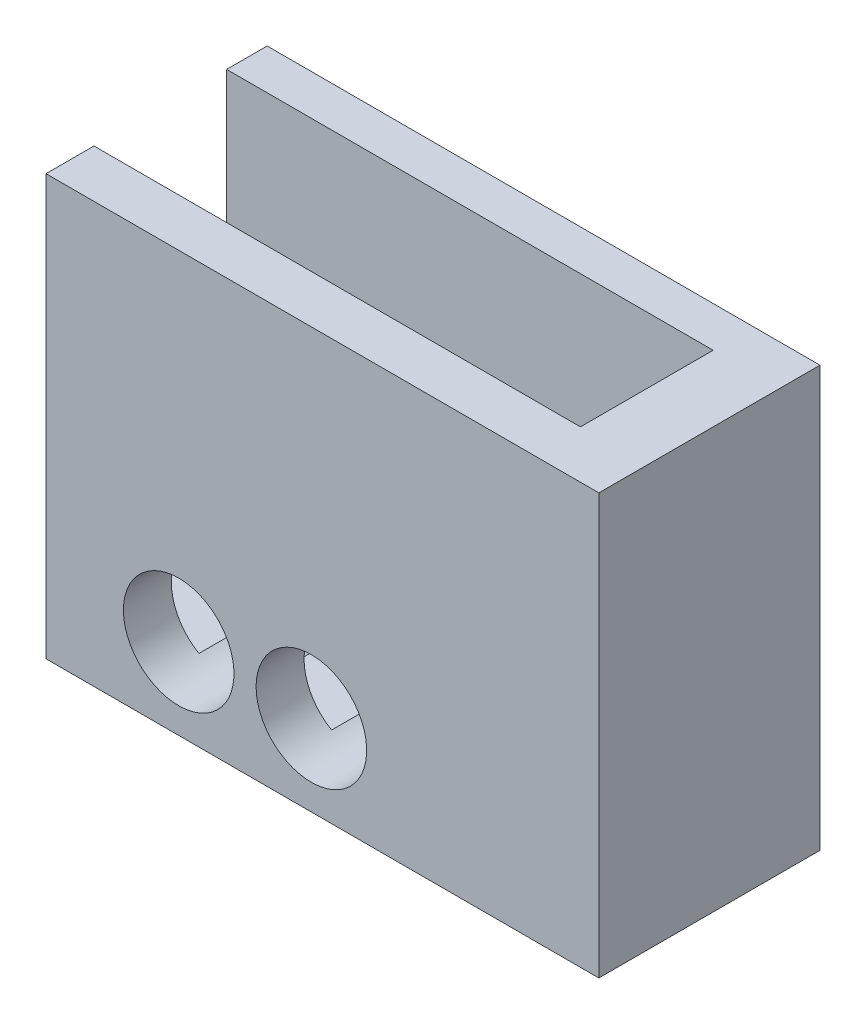
ISO-10303-21;
HEADER;
FILE_DESCRIPTION(('STEP AP214'),'2;1');
FILE_NAME('part.step','',(''),(''),'','','');
FILE_SCHEMA(('AUTOMOTIVE_DESIGN { 1 0 10303 214 1 1 1 1 }'));
ENDSEC;
DATA;
#1=APPLICATION_CONTEXT('core data for automotive mechanical design processes');
#2=APPLICATION_PROTOCOL_DEFINITION('international standard','automotive_design',2000,#1);
#3=PRODUCT_CONTEXT('',#1,'mechanical');
#4=PRODUCT('Part','Part','',(#3));
#5=PRODUCT_RELATED_PRODUCT_CATEGORY('part','',(#4));
#6=PRODUCT_DEFINITION_FORMATION('','',#4);
#7=PRODUCT_DEFINITION_CONTEXT('part definition',#1,'design');
#8=PRODUCT_DEFINITION('design','',#6,#7);
#9=PRODUCT_DEFINITION_SHAPE('','',#8);
#10=(LENGTH_UNIT() NAMED_UNIT(*) SI_UNIT(.MILLI.,.METRE.));
#11=(NAMED_UNIT(*) PLANE_ANGLE_UNIT() SI_UNIT($,.RADIAN.));
#12=(NAMED_UNIT(*) SI_UNIT($,.STERADIAN.) SOLID_ANGLE_UNIT());
#13=UNCERTAINTY_MEASURE_WITH_UNIT(LENGTH_MEASURE(1.E-05),#10,'distance_accuracy_value','');
#14=(GEOMETRIC_REPRESENTATION_CONTEXT(3) GLOBAL_UNCERTAINTY_ASSIGNED_CONTEXT((#13)) GLOBAL_UNIT_ASSIGNED_CONTEXT((#10,
#11,#12)) REPRESENTATION_CONTEXT('',''));
#15=CARTESIAN_POINT('',(0.,0.,0.));
#16=DIRECTION('',(0.,0.,1.));
#17=DIRECTION('',(1.,0.,0.));
#18=AXIS2_PLACEMENT_3D('',#15,#16,#17);
#19=CARTESIAN_POINT('',(0.,1.5,0.));
#20=DIRECTION('',(0.,1.,0.));
#21=DIRECTION('',(0.,0.,1.));
#22=AXIS2_PLACEMENT_3D('',#19,#20,#21);
#23=PLANE('',#22);
#24=DIRECTION('',(0.,0.,-1.));
#25=VECTOR('',#24,1.);
#26=CARTESIAN_POINT('',(5.9615656121089,1.5,13.8375));
#27=LINE('',#26,#25);
#28=CARTESIAN_POINT('',(5.9615656121089,1.5,1.66912467879835));
#29=VERTEX_POINT('',#28);
#30=CARTESIAN_POINT('',(5.9615656121089,1.5,-4.33087532120164));
#31=VERTEX_POINT('',#30);
#32=EDGE_CURVE('E12',#29,#31,#27,.T.);
#33=ORIENTED_EDGE('',*,*,#32,.F.);
#34=DIRECTION('',(1.,0.,0.));
#35=VECTOR('',#34,1.);
#36=CARTESIAN_POINT('',(0.,1.5,1.66912467879835));
#37=LINE('',#36,#35);
#38=CARTESIAN_POINT('',(14.7083333333333,1.5,1.66912467879835));
#39=VERTEX_POINT('',#38);
#40=EDGE_CURVE('E172',#29,#39,#37,.T.);
#41=ORIENTED_EDGE('',*,*,#40,.T.);
#42=DIRECTION('',(0.,0.,1.));
#43=VECTOR('',#42,1.);
#44=CARTESIAN_POINT('',(14.7083333333333,1.5,0.));
#45=LINE('',#44,#43);
#46=CARTESIAN_POINT('',(14.7083333333333,1.5,-4.33087532120165));
#47=VERTEX_POINT('',#46);
#48=EDGE_CURVE('E186',#47,#39,#45,.T.);
#49=ORIENTED_EDGE('',*,*,#48,.F.);
#50=DIRECTION('',(1.,0.,0.));
#51=VECTOR('',#50,1.);
#52=CARTESIAN_POINT('',(0.,1.5,-4.33087532120165));
#53=LINE('',#52,#51);
#54=EDGE_CURVE('E184',#31,#47,#53,.T.);
#55=ORIENTED_EDGE('',*,*,#54,.F.);
#56=EDGE_LOOP('',(#33,#41,#49,#55));
#57=FACE_BOUND('',#56,.T.);
#58=ADVANCED_FACE('F57',(#57),#23,.T.);
#59=DIRECTION('',(0.,0.,-1.));
#60=VECTOR('',#59,1.);
#61=CARTESIAN_POINT('',(3.4551010545578,1.5,13.8375));
#62=LINE('',#61,#60);
#63=CARTESIAN_POINT('',(3.4551010545578,1.5,-4.33087532120165));
#64=VERTEX_POINT('',#63);
#65=CARTESIAN_POINT('',(3.4551010545578,1.5,1.66912467879836));
#66=VERTEX_POINT('',#65);
#67=EDGE_CURVE('E65',#64,#66,#62,.F.);
#68=ORIENTED_EDGE('',*,*,#67,.F.);
#69=CARTESIAN_POINT('',(-0.0384343878911,1.5,-4.33087532120164));
#70=VERTEX_POINT('',#69);
#71=EDGE_CURVE('E182',#70,#64,#53,.T.);
#72=ORIENTED_EDGE('',*,*,#71,.F.);
#73=DIRECTION('',(0.,0.,-1.));
#74=VECTOR('',#73,1.);
#75=CARTESIAN_POINT('',(-0.0384343878911,1.5,13.8375));
#76=LINE('',#75,#74);
#77=CARTESIAN_POINT('',(-0.0384343878911,1.5,1.66912467879835));
#78=VERTEX_POINT('',#77);
#79=EDGE_CURVE('E152',#78,#70,#76,.T.);
#80=ORIENTED_EDGE('',*,*,#79,.F.);
#81=EDGE_CURVE('E164',#78,#66,#37,.T.);
#82=ORIENTED_EDGE('',*,*,#81,.T.);
#83=EDGE_LOOP('',(#68,#72,#80,#82));
#84=FACE_BOUND('',#83,.T.);
#85=ADVANCED_FACE('F262',(#84),#23,.T.);
#86=CARTESIAN_POINT('',(-7.29166666666665,19.,-6.1625));
#87=DIRECTION('',(1.,0.,0.));
#88=DIRECTION('',(0.,0.,-1.));
#89=AXIS2_PLACEMENT_3D('',#86,#87,#88);
#90=PLANE('',#89);
#91=DIRECTION('',(0.,1.,0.));
#92=VECTOR('',#91,1.);
#93=CARTESIAN_POINT('',(-7.29166666666665,1.5,-4.33087532120165));
#94=LINE('',#93,#92);
#95=CARTESIAN_POINT('',(-7.29166666666665,1.5,-4.33087532120165));
#96=VERTEX_POINT('',#95);
#97=CARTESIAN_POINT('',(-7.29166666666665,19.,-4.33087532120165));
#98=VERTEX_POINT('',#97);
#99=EDGE_CURVE('E173',#96,#98,#94,.T.);
#100=ORIENTED_EDGE('',*,*,#99,.T.);
#101=DIRECTION('',(0.,0.,1.));
#102=VECTOR('',#101,1.);
#103=CARTESIAN_POINT('',(-7.29166666666665,19.,-6.1625));
#104=LINE('',#103,#102);
#105=CARTESIAN_POINT('',(-7.29166666666665,19.,-6.1625));
#106=VERTEX_POINT('',#105);
#107=EDGE_CURVE('E238',#106,#98,#104,.T.);
#108=ORIENTED_EDGE('',*,*,#107,.F.);
#109=DIRECTION('',(0.,-1.,0.));
#110=VECTOR('',#109,1.);
#111=CARTESIAN_POINT('',(-7.29166666666665,19.,-6.1625));
#112=LINE('',#111,#110);
#113=CARTESIAN_POINT('',(-7.29166666666665,0.,-6.1625));
#114=VERTEX_POINT('',#113);
#115=EDGE_CURVE('E222',#106,#114,#112,.T.);
#116=ORIENTED_EDGE('',*,*,#115,.T.);
#117=DIRECTION('',(0.,0.,1.));
#118=VECTOR('',#117,1.);
#119=CARTESIAN_POINT('',(-7.29166666666665,0.,-6.1625));
#120=LINE('',#119,#118);
#121=CARTESIAN_POINT('',(-7.29166666666665,0.,3.8375));
#122=VERTEX_POINT('',#121);
#123=EDGE_CURVE('E236',#114,#122,#120,.T.);
#124=ORIENTED_EDGE('',*,*,#123,.T.);
#125=DIRECTION('',(0.,-1.,0.));
#126=VECTOR('',#125,1.);
#127=CARTESIAN_POINT('',(-7.29166666666665,19.,3.8375));
#128=LINE('',#127,#126);
#129=CARTESIAN_POINT('',(-7.29166666666665,19.,3.8375));
#130=VERTEX_POINT('',#129);
#131=EDGE_CURVE('E153',#130,#122,#128,.T.);
#132=ORIENTED_EDGE('',*,*,#131,.F.);
#133=CARTESIAN_POINT('',(-7.29166666666665,19.,1.66912467879835));
#134=VERTEX_POINT('',#133);
#135=EDGE_CURVE('E229',#134,#130,#104,.T.);
#136=ORIENTED_EDGE('',*,*,#135,.F.);
#137=DIRECTION('',(0.,1.,0.));
#138=VECTOR('',#137,1.);
#139=CARTESIAN_POINT('',(-7.29166666666665,1.5,1.66912467879835));
#140=LINE('',#139,#138);
#141=CARTESIAN_POINT('',(-7.29166666666665,1.5,1.66912467879835));
#142=VERTEX_POINT('',#141);
#143=EDGE_CURVE('E246',#142,#134,#140,.T.);
#144=ORIENTED_EDGE('',*,*,#143,.F.);
#145=DIRECTION('',(0.,0.,1.));
#146=VECTOR('',#145,1.);
#147=CARTESIAN_POINT('',(-7.29166666666665,1.5,0.));
#148=LINE('',#147,#146);
#149=EDGE_CURVE('E169',#96,#142,#148,.T.);
#150=ORIENTED_EDGE('',*,*,#149,.F.);
#151=EDGE_LOOP('',(#100,#108,#116,#124,#132,#136,#144,#150));
#152=FACE_BOUND('',#151,.T.);
#153=ADVANCED_FACE('F59',(#152),#90,.F.);
#154=CARTESIAN_POINT('',(0.,19.,0.));
#155=DIRECTION('',(0.,1.,0.));
#156=DIRECTION('',(0.,0.,1.));
#157=AXIS2_PLACEMENT_3D('',#154,#155,#156);
#158=PLANE('',#157);
#159=ORIENTED_EDGE('',*,*,#107,.T.);
#160=DIRECTION('',(1.,0.,0.));
#161=VECTOR('',#160,1.);
#162=CARTESIAN_POINT('',(0.,19.,-4.33087532120165));
#163=LINE('',#162,#161);
#164=CARTESIAN_POINT('',(14.7083333333333,19.,-4.33087532120165));
#165=VERTEX_POINT('',#164);
#166=EDGE_CURVE('E280',#98,#165,#163,.T.);
#167=ORIENTED_EDGE('',*,*,#166,.T.);
#168=DIRECTION('',(0.,0.,1.));
#169=VECTOR('',#168,1.);
#170=CARTESIAN_POINT('',(14.7083333333333,19.,0.));
#171=LINE('',#170,#169);
#172=CARTESIAN_POINT('',(14.7083333333333,19.,1.66912467879835));
#173=VERTEX_POINT('',#172);
#174=EDGE_CURVE('E192',#165,#173,#171,.T.);
#175=ORIENTED_EDGE('',*,*,#174,.T.);
#176=DIRECTION('',(1.,0.,0.));
#177=VECTOR('',#176,1.);
#178=CARTESIAN_POINT('',(0.,19.,1.66912467879835));
#179=LINE('',#178,#177);
#180=EDGE_CURVE('E188',#134,#173,#179,.T.);
#181=ORIENTED_EDGE('',*,*,#180,.F.);
#182=ORIENTED_EDGE('',*,*,#135,.T.);
#183=DIRECTION('',(1.,0.,0.));
#184=VECTOR('',#183,1.);
#185=CARTESIAN_POINT('',(-7.29166666666665,19.,3.8375));
#186=LINE('',#185,#184);
#187=CARTESIAN_POINT('',(17.7083333333333,19.,3.8375));
#188=VERTEX_POINT('',#187);
#189=EDGE_CURVE('E273',#130,#188,#186,.T.);
#190=ORIENTED_EDGE('',*,*,#189,.T.);
#191=DIRECTION('',(0.,0.,-1.));
#192=VECTOR('',#191,1.);
#193=CARTESIAN_POINT('',(17.7083333333333,19.,-6.1625));
#194=LINE('',#193,#192);
#195=CARTESIAN_POINT('',(17.7083333333333,19.,-6.1625));
#196=VERTEX_POINT('',#195);
#197=EDGE_CURVE('E274',#188,#196,#194,.T.);
#198=ORIENTED_EDGE('',*,*,#197,.T.);
#199=DIRECTION('',(-1.,0.,0.));
#200=VECTOR('',#199,1.);
#201=CARTESIAN_POINT('',(-7.29166666666665,19.,-6.1625));
#202=LINE('',#201,#200);
#203=EDGE_CURVE('E239',#196,#106,#202,.T.);
#204=ORIENTED_EDGE('',*,*,#203,.T.);
#205=EDGE_LOOP('',(#159,#167,#175,#181,#182,#190,#198,#204));
#206=FACE_BOUND('',#205,.T.);
#207=ADVANCED_FACE('F277',(#206),#158,.T.);
#208=CARTESIAN_POINT('',(-7.29166666666665,19.,3.8375));
#209=DIRECTION('',(0.,0.,-1.));
#210=DIRECTION('',(-1.,0.,0.));
#211=AXIS2_PLACEMENT_3D('',#208,#209,#210);
#212=PLANE('',#211);
#213=CARTESIAN_POINT('',(4.70833333333335,3.66319413262773,3.8375));
#214=DIRECTION('',(0.,0.,-1.));
#215=DIRECTION('',(-1.,0.,0.));
#216=AXIS2_PLACEMENT_3D('',#213,#214,#215);
#217=CIRCLE('',#216,2.5);
#218=CARTESIAN_POINT('',(2.20833333333335,3.66319413262773,3.8375));
#219=VERTEX_POINT('',#218);
#220=EDGE_CURVE('E189',#219,#219,#217,.T.);
#221=ORIENTED_EDGE('',*,*,#220,.T.);
#222=EDGE_LOOP('',(#221));
#223=FACE_BOUND('',#222,.T.);
#224=CARTESIAN_POINT('',(-1.29166666666665,3.66319413262773,3.8375));
#225=DIRECTION('',(0.,0.,-1.));
#226=DIRECTION('',(-1.,0.,0.));
#227=AXIS2_PLACEMENT_3D('',#224,#225,#226);
#228=CIRCLE('',#227,2.5);
#229=CARTESIAN_POINT('',(-3.79166666666665,3.66319413262773,3.8375));
#230=VERTEX_POINT('',#229);
#231=EDGE_CURVE('E196',#230,#230,#228,.T.);
#232=ORIENTED_EDGE('',*,*,#231,.T.);
#233=EDGE_LOOP('',(#232));
#234=FACE_BOUND('',#233,.T.);
#235=DIRECTION('',(1.,0.,0.));
#236=VECTOR('',#235,1.);
#237=CARTESIAN_POINT('',(-7.29166666666665,0.,3.8375));
#238=LINE('',#237,#236);
#239=CARTESIAN_POINT('',(17.7083333333333,0.,3.8375));
#240=VERTEX_POINT('',#239);
#241=EDGE_CURVE('E241',#122,#240,#238,.T.);
#242=ORIENTED_EDGE('',*,*,#241,.T.);
#243=DIRECTION('',(0.,-1.,0.));
#244=VECTOR('',#243,1.);
#245=CARTESIAN_POINT('',(17.7083333333333,19.,3.8375));
#246=LINE('',#245,#244);
#247=EDGE_CURVE('E253',#188,#240,#246,.T.);
#248=ORIENTED_EDGE('',*,*,#247,.F.);
#249=ORIENTED_EDGE('',*,*,#189,.F.);
#250=ORIENTED_EDGE('',*,*,#131,.T.);
#251=EDGE_LOOP('',(#242,#248,#249,#250));
#252=FACE_BOUND('',#251,.T.);
#253=ADVANCED_FACE('F286',(#223,#234,#252),#212,.F.);
#254=CARTESIAN_POINT('',(17.7083333333333,19.,-6.1625));
#255=DIRECTION('',(-1.,0.,0.));
#256=DIRECTION('',(0.,0.,1.));
#257=AXIS2_PLACEMENT_3D('',#254,#255,#256);
#258=PLANE('',#257);
#259=DIRECTION('',(0.,0.,-1.));
#260=VECTOR('',#259,1.);
#261=CARTESIAN_POINT('',(17.7083333333333,0.,-6.1625));
#262=LINE('',#261,#260);
#263=CARTESIAN_POINT('',(17.7083333333333,0.,-6.1625));
#264=VERTEX_POINT('',#263);
#265=EDGE_CURVE('E230',#240,#264,#262,.T.);
#266=ORIENTED_EDGE('',*,*,#265,.T.);
#267=DIRECTION('',(0.,-1.,0.));
#268=VECTOR('',#267,1.);
#269=CARTESIAN_POINT('',(17.7083333333333,19.,-6.1625));
#270=LINE('',#269,#268);
#271=EDGE_CURVE('E225',#196,#264,#270,.T.);
#272=ORIENTED_EDGE('',*,*,#271,.F.);
#273=ORIENTED_EDGE('',*,*,#197,.F.);
#274=ORIENTED_EDGE('',*,*,#247,.T.);
#275=EDGE_LOOP('',(#266,#272,#273,#274));
#276=FACE_BOUND('',#275,.T.);
#277=ADVANCED_FACE('F212',(#276),#258,.F.);
#278=CARTESIAN_POINT('',(-7.29166666666665,19.,-6.1625));
#279=DIRECTION('',(0.,0.,1.));
#280=DIRECTION('',(1.,0.,0.));
#281=AXIS2_PLACEMENT_3D('',#278,#279,#280);
#282=PLANE('',#281);
#283=CARTESIAN_POINT('',(4.70833333333335,3.66319413262773,-6.1625));
#284=DIRECTION('',(0.,0.,-1.));
#285=DIRECTION('',(-1.,0.,0.));
#286=AXIS2_PLACEMENT_3D('',#283,#284,#285);
#287=CIRCLE('',#286,2.5);
#288=CARTESIAN_POINT('',(2.20833333333335,3.66319413262773,-6.1625));
#289=VERTEX_POINT('',#288);
#290=EDGE_CURVE('E165',#289,#289,#287,.T.);
#291=ORIENTED_EDGE('',*,*,#290,.F.);
#292=EDGE_LOOP('',(#291));
#293=FACE_BOUND('',#292,.T.);
#294=CARTESIAN_POINT('',(-1.29166666666665,3.66319413262773,-6.1625));
#295=DIRECTION('',(0.,0.,-1.));
#296=DIRECTION('',(-1.,0.,0.));
#297=AXIS2_PLACEMENT_3D('',#294,#295,#296);
#298=CIRCLE('',#297,2.5);
#299=CARTESIAN_POINT('',(-3.79166666666665,3.66319413262773,-6.1625));
#300=VERTEX_POINT('',#299);
#301=EDGE_CURVE('E200',#300,#300,#298,.T.);
#302=ORIENTED_EDGE('',*,*,#301,.F.);
#303=EDGE_LOOP('',(#302));
#304=FACE_BOUND('',#303,.T.);
#305=DIRECTION('',(-1.,0.,0.));
#306=VECTOR('',#305,1.);
#307=CARTESIAN_POINT('',(-7.29166666666665,0.,-6.1625));
#308=LINE('',#307,#306);
#309=EDGE_CURVE('E219',#264,#114,#308,.T.);
#310=ORIENTED_EDGE('',*,*,#309,.T.);
#311=ORIENTED_EDGE('',*,*,#115,.F.);
#312=ORIENTED_EDGE('',*,*,#203,.F.);
#313=ORIENTED_EDGE('',*,*,#271,.T.);
#314=EDGE_LOOP('',(#310,#311,#312,#313));
#315=FACE_BOUND('',#314,.T.);
#316=ADVANCED_FACE('F208',(#293,#304,#315),#282,.F.);
#317=CARTESIAN_POINT('',(0.,0.,0.));
#318=DIRECTION('',(0.,1.,0.));
#319=DIRECTION('',(0.,0.,1.));
#320=AXIS2_PLACEMENT_3D('',#317,#318,#319);
#321=PLANE('',#320);
#322=ORIENTED_EDGE('',*,*,#123,.F.);
#323=ORIENTED_EDGE('',*,*,#309,.F.);
#324=ORIENTED_EDGE('',*,*,#265,.F.);
#325=ORIENTED_EDGE('',*,*,#241,.F.);
#326=EDGE_LOOP('',(#322,#323,#324,#325));
#327=FACE_BOUND('',#326,.T.);
#328=ADVANCED_FACE('F211',(#327),#321,.F.);
#329=CARTESIAN_POINT('',(14.7083333333333,1.5,0.));
#330=DIRECTION('',(-1.,0.,0.));
#331=DIRECTION('',(0.,0.,1.));
#332=AXIS2_PLACEMENT_3D('',#329,#330,#331);
#333=PLANE('',#332);
#334=ORIENTED_EDGE('',*,*,#174,.F.);
#335=DIRECTION('',(0.,1.,0.));
#336=VECTOR('',#335,1.);
#337=CARTESIAN_POINT('',(14.7083333333333,1.5,-4.33087532120165));
#338=LINE('',#337,#336);
#339=EDGE_CURVE('E170',#47,#165,#338,.T.);
#340=ORIENTED_EDGE('',*,*,#339,.F.);
#341=ORIENTED_EDGE('',*,*,#48,.T.);
#342=DIRECTION('',(0.,1.,0.));
#343=VECTOR('',#342,1.);
#344=CARTESIAN_POINT('',(14.7083333333333,1.5,1.66912467879835));
#345=LINE('',#344,#343);
#346=EDGE_CURVE('E243',#39,#173,#345,.T.);
#347=ORIENTED_EDGE('',*,*,#346,.T.);
#348=EDGE_LOOP('',(#334,#340,#341,#347));
#349=FACE_BOUND('',#348,.T.);
#350=ADVANCED_FACE('F310',(#349),#333,.T.);
#351=CARTESIAN_POINT('',(0.,1.5,-4.33087532120165));
#352=DIRECTION('',(0.,0.,1.));
#353=DIRECTION('',(1.,0.,0.));
#354=AXIS2_PLACEMENT_3D('',#351,#352,#353);
#355=PLANE('',#354);
#356=CARTESIAN_POINT('',(4.70833333333335,3.66319413262773,-4.33087532120164));
#357=DIRECTION('',(0.,0.,1.));
#358=DIRECTION('',(1.,0.,0.));
#359=AXIS2_PLACEMENT_3D('',#356,#357,#358);
#360=CIRCLE('',#359,2.5);
#361=EDGE_CURVE('E71',#31,#64,#360,.T.);
#362=ORIENTED_EDGE('',*,*,#361,.F.);
#363=ORIENTED_EDGE('',*,*,#54,.T.);
#364=ORIENTED_EDGE('',*,*,#339,.T.);
#365=ORIENTED_EDGE('',*,*,#166,.F.);
#366=ORIENTED_EDGE('',*,*,#99,.F.);
#367=CARTESIAN_POINT('',(-2.54489894544221,1.5,-4.33087532120165));
#368=VERTEX_POINT('',#367);
#369=EDGE_CURVE('E181',#96,#368,#53,.T.);
#370=ORIENTED_EDGE('',*,*,#369,.T.);
#371=CARTESIAN_POINT('',(-1.29166666666665,3.66319413262773,-4.33087532120164));
#372=DIRECTION('',(0.,0.,1.));
#373=DIRECTION('',(1.,0.,0.));
#374=AXIS2_PLACEMENT_3D('',#371,#372,#373);
#375=CIRCLE('',#374,2.5);
#376=EDGE_CURVE('E79',#70,#368,#375,.T.);
#377=ORIENTED_EDGE('',*,*,#376,.F.);
#378=ORIENTED_EDGE('',*,*,#71,.T.);
#379=EDGE_LOOP('',(#362,#363,#364,#365,#366,#370,#377,#378));
#380=FACE_BOUND('',#379,.T.);
#381=ADVANCED_FACE('F264',(#380),#355,.T.);
#382=CARTESIAN_POINT('',(0.,1.5,1.66912467879835));
#383=DIRECTION('',(0.,0.,1.));
#384=DIRECTION('',(1.,0.,0.));
#385=AXIS2_PLACEMENT_3D('',#382,#383,#384);
#386=PLANE('',#385);
#387=ORIENTED_EDGE('',*,*,#40,.F.);
#388=CARTESIAN_POINT('',(4.70833333333335,3.66319413262773,1.66912467879835));
#389=DIRECTION('',(0.,0.,1.));
#390=DIRECTION('',(1.,0.,0.));
#391=AXIS2_PLACEMENT_3D('',#388,#389,#390);
#392=CIRCLE('',#391,2.5);
#393=EDGE_CURVE('E194',#29,#66,#392,.T.);
#394=ORIENTED_EDGE('',*,*,#393,.T.);
#395=ORIENTED_EDGE('',*,*,#81,.F.);
#396=CARTESIAN_POINT('',(-1.29166666666665,3.66319413262773,1.66912467879835));
#397=DIRECTION('',(0.,0.,1.));
#398=DIRECTION('',(1.,0.,0.));
#399=AXIS2_PLACEMENT_3D('',#396,#397,#398);
#400=CIRCLE('',#399,2.5);
#401=CARTESIAN_POINT('',(-2.54489894544221,1.5,1.66912467879836));
#402=VERTEX_POINT('',#401);
#403=EDGE_CURVE('E146',#78,#402,#400,.T.);
#404=ORIENTED_EDGE('',*,*,#403,.T.);
#405=EDGE_CURVE('E160',#142,#402,#37,.T.);
#406=ORIENTED_EDGE('',*,*,#405,.F.);
#407=ORIENTED_EDGE('',*,*,#143,.T.);
#408=ORIENTED_EDGE('',*,*,#180,.T.);
#409=ORIENTED_EDGE('',*,*,#346,.F.);
#410=EDGE_LOOP('',(#387,#394,#395,#404,#406,#407,#408,#409));
#411=FACE_BOUND('',#410,.T.);
#412=ADVANCED_FACE('F159',(#411),#386,.F.);
#413=DIRECTION('',(0.,0.,-1.));
#414=VECTOR('',#413,1.);
#415=CARTESIAN_POINT('',(-2.54489894544221,1.5,13.8375));
#416=LINE('',#415,#414);
#417=EDGE_CURVE('E142',#368,#402,#416,.F.);
#418=ORIENTED_EDGE('',*,*,#417,.F.);
#419=ORIENTED_EDGE('',*,*,#369,.F.);
#420=ORIENTED_EDGE('',*,*,#149,.T.);
#421=ORIENTED_EDGE('',*,*,#405,.T.);
#422=EDGE_LOOP('',(#418,#419,#420,#421));
#423=FACE_BOUND('',#422,.T.);
#424=ADVANCED_FACE('F167',(#423),#23,.T.);
#425=CARTESIAN_POINT('',(-1.29166666666665,3.66319413262773,13.8375));
#426=DIRECTION('',(0.,0.,-1.));
#427=DIRECTION('',(-1.,0.,0.));
#428=AXIS2_PLACEMENT_3D('',#425,#426,#427);
#429=CYLINDRICAL_SURFACE('',#428,2.5);
#430=ORIENTED_EDGE('',*,*,#301,.T.);
#431=EDGE_LOOP('',(#430));
#432=FACE_BOUND('',#431,.T.);
#433=ORIENTED_EDGE('',*,*,#79,.T.);
#434=ORIENTED_EDGE('',*,*,#376,.T.);
#435=ORIENTED_EDGE('',*,*,#417,.T.);
#436=ORIENTED_EDGE('',*,*,#403,.F.);
#437=EDGE_LOOP('',(#433,#434,#435,#436));
#438=FACE_BOUND('',#437,.T.);
#439=ORIENTED_EDGE('',*,*,#231,.F.);
#440=EDGE_LOOP('',(#439));
#441=FACE_BOUND('',#440,.T.);
#442=ADVANCED_FACE('F144',(#432,#438,#441),#429,.F.);
#443=CARTESIAN_POINT('',(4.70833333333335,3.66319413262773,13.8375));
#444=DIRECTION('',(0.,0.,-1.));
#445=DIRECTION('',(-1.,0.,0.));
#446=AXIS2_PLACEMENT_3D('',#443,#444,#445);
#447=CYLINDRICAL_SURFACE('',#446,2.5);
#448=ORIENTED_EDGE('',*,*,#290,.T.);
#449=EDGE_LOOP('',(#448));
#450=FACE_BOUND('',#449,.T.);
#451=ORIENTED_EDGE('',*,*,#32,.T.);
#452=ORIENTED_EDGE('',*,*,#361,.T.);
#453=ORIENTED_EDGE('',*,*,#67,.T.);
#454=ORIENTED_EDGE('',*,*,#393,.F.);
#455=EDGE_LOOP('',(#451,#452,#453,#454));
#456=FACE_BOUND('',#455,.T.);
#457=ORIENTED_EDGE('',*,*,#220,.F.);
#458=EDGE_LOOP('',(#457));
#459=FACE_BOUND('',#458,.T.);
#460=ADVANCED_FACE('F206',(#450,#456,#459),#447,.F.);
#461=CLOSED_SHELL('',(#58,#85,#153,#207,#253,#277,#316,#328,#350,#381,#412,#424,#442,#460));
#462=MANIFOLD_SOLID_BREP('B2',#461);
#463=ADVANCED_BREP_SHAPE_REPRESENTATION('',(#18,#462),#14);
#464=SHAPE_DEFINITION_REPRESENTATION(#9,#463);
ENDSEC;
END-ISO-10303-21;
